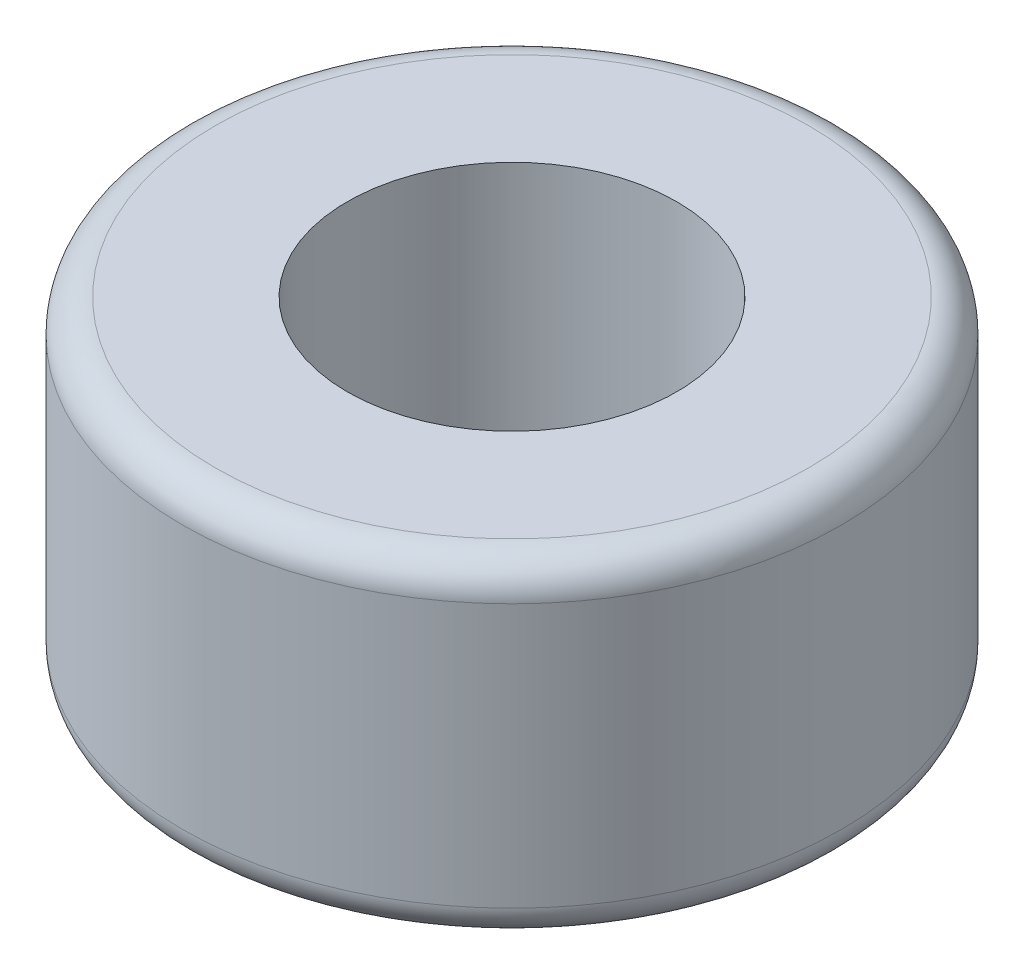
ISO-10303-21;
HEADER;
FILE_DESCRIPTION(('STEP AP214'),'2;1');
FILE_NAME('part.step','',(''),(''),'','','');
FILE_SCHEMA(('AUTOMOTIVE_DESIGN { 1 0 10303 214 1 1 1 1 }'));
ENDSEC;
DATA;
#1=APPLICATION_CONTEXT('core data for automotive mechanical design processes');
#2=APPLICATION_PROTOCOL_DEFINITION('international standard','automotive_design',2000,#1);
#3=PRODUCT_CONTEXT('',#1,'mechanical');
#4=PRODUCT('Part','Part','',(#3));
#5=PRODUCT_RELATED_PRODUCT_CATEGORY('part','',(#4));
#6=PRODUCT_DEFINITION_FORMATION('','',#4);
#7=PRODUCT_DEFINITION_CONTEXT('part definition',#1,'design');
#8=PRODUCT_DEFINITION('design','',#6,#7);
#9=PRODUCT_DEFINITION_SHAPE('','',#8);
#10=(LENGTH_UNIT() NAMED_UNIT(*) SI_UNIT(.MILLI.,.METRE.));
#11=(NAMED_UNIT(*) PLANE_ANGLE_UNIT() SI_UNIT($,.RADIAN.));
#12=(NAMED_UNIT(*) SI_UNIT($,.STERADIAN.) SOLID_ANGLE_UNIT());
#13=UNCERTAINTY_MEASURE_WITH_UNIT(LENGTH_MEASURE(1.E-05),#10,'distance_accuracy_value','');
#14=(GEOMETRIC_REPRESENTATION_CONTEXT(3) GLOBAL_UNCERTAINTY_ASSIGNED_CONTEXT((#13)) GLOBAL_UNIT_ASSIGNED_CONTEXT((#10,
#11,#12)) REPRESENTATION_CONTEXT('',''));
#15=CARTESIAN_POINT('',(0.,0.,0.));
#16=DIRECTION('',(0.,0.,1.));
#17=DIRECTION('',(1.,0.,0.));
#18=AXIS2_PLACEMENT_3D('',#15,#16,#17);
#19=CARTESIAN_POINT('',(0.,1.,0.));
#20=DIRECTION('',(0.,1.,0.));
#21=DIRECTION('',(0.,0.,1.));
#22=AXIS2_PLACEMENT_3D('',#19,#20,#21);
#23=PLANE('',#22);
#24=CARTESIAN_POINT('',(0.,1.,0.));
#25=DIRECTION('',(0.,1.,0.));
#26=DIRECTION('',(0.,0.,1.));
#27=AXIS2_PLACEMENT_3D('',#24,#25,#26);
#28=CIRCLE('',#27,0.9);
#29=CARTESIAN_POINT('',(0.,1.,0.9));
#30=VERTEX_POINT('',#29);
#31=EDGE_CURVE('E45',#30,#30,#28,.T.);
#32=ORIENTED_EDGE('',*,*,#31,.T.);
#33=EDGE_LOOP('',(#32));
#34=FACE_BOUND('',#33,.T.);
#35=CARTESIAN_POINT('',(0.,1.,0.));
#36=DIRECTION('',(0.,1.,0.));
#37=DIRECTION('',(0.,0.,1.));
#38=AXIS2_PLACEMENT_3D('',#35,#36,#37);
#39=CIRCLE('',#38,0.5);
#40=CARTESIAN_POINT('',(0.,1.,0.5));
#41=VERTEX_POINT('',#40);
#42=EDGE_CURVE('E50',#41,#41,#39,.T.);
#43=ORIENTED_EDGE('',*,*,#42,.F.);
#44=EDGE_LOOP('',(#43));
#45=FACE_BOUND('',#44,.T.);
#46=ADVANCED_FACE('F30',(#34,#45),#23,.T.);
#47=CARTESIAN_POINT('',(0.,0.,0.));
#48=DIRECTION('',(0.,1.,0.));
#49=DIRECTION('',(0.,0.,1.));
#50=AXIS2_PLACEMENT_3D('',#47,#48,#49);
#51=PLANE('',#50);
#52=CARTESIAN_POINT('',(0.,0.,0.));
#53=DIRECTION('',(0.,1.,0.));
#54=DIRECTION('',(0.,0.,1.));
#55=AXIS2_PLACEMENT_3D('',#52,#53,#54);
#56=CIRCLE('',#55,0.9);
#57=CARTESIAN_POINT('',(0.,0.,0.9));
#58=VERTEX_POINT('',#57);
#59=EDGE_CURVE('E10',#58,#58,#56,.F.);
#60=ORIENTED_EDGE('',*,*,#59,.T.);
#61=EDGE_LOOP('',(#60));
#62=FACE_BOUND('',#61,.T.);
#63=CARTESIAN_POINT('',(0.,0.,0.));
#64=DIRECTION('',(0.,1.,0.));
#65=DIRECTION('',(0.,0.,1.));
#66=AXIS2_PLACEMENT_3D('',#63,#64,#65);
#67=CIRCLE('',#66,0.5);
#68=CARTESIAN_POINT('',(0.,0.,0.5));
#69=VERTEX_POINT('',#68);
#70=EDGE_CURVE('E51',#69,#69,#67,.T.);
#71=ORIENTED_EDGE('',*,*,#70,.T.);
#72=EDGE_LOOP('',(#71));
#73=FACE_BOUND('',#72,.T.);
#74=ADVANCED_FACE('F61',(#62,#73),#51,.F.);
#75=CARTESIAN_POINT('',(0.,1.,0.));
#76=DIRECTION('',(0.,-1.,0.));
#77=DIRECTION('',(0.,0.,-1.));
#78=AXIS2_PLACEMENT_3D('',#75,#76,#77);
#79=CYLINDRICAL_SURFACE('',#78,1.);
#80=CARTESIAN_POINT('',(0.,0.1,0.));
#81=DIRECTION('',(0.,1.,0.));
#82=DIRECTION('',(0.,0.,1.));
#83=AXIS2_PLACEMENT_3D('',#80,#81,#82);
#84=CIRCLE('',#83,1.);
#85=CARTESIAN_POINT('',(0.,0.1,1.));
#86=VERTEX_POINT('',#85);
#87=EDGE_CURVE('E37',#86,#86,#84,.T.);
#88=ORIENTED_EDGE('',*,*,#87,.T.);
#89=EDGE_LOOP('',(#88));
#90=FACE_BOUND('',#89,.T.);
#91=CARTESIAN_POINT('',(0.,0.9,0.));
#92=DIRECTION('',(0.,1.,0.));
#93=DIRECTION('',(0.,0.,1.));
#94=AXIS2_PLACEMENT_3D('',#91,#92,#93);
#95=CIRCLE('',#94,1.);
#96=CARTESIAN_POINT('',(0.,0.9,1.));
#97=VERTEX_POINT('',#96);
#98=EDGE_CURVE('E41',#97,#97,#95,.F.);
#99=ORIENTED_EDGE('',*,*,#98,.T.);
#100=EDGE_LOOP('',(#99));
#101=FACE_BOUND('',#100,.T.);
#102=ADVANCED_FACE('F67',(#90,#101),#79,.T.);
#103=CARTESIAN_POINT('',(0.,1.,0.));
#104=DIRECTION('',(0.,-1.,0.));
#105=DIRECTION('',(0.,0.,-1.));
#106=AXIS2_PLACEMENT_3D('',#103,#104,#105);
#107=CYLINDRICAL_SURFACE('',#106,0.5);
#108=ORIENTED_EDGE('',*,*,#42,.T.);
#109=EDGE_LOOP('',(#108));
#110=FACE_BOUND('',#109,.T.);
#111=ORIENTED_EDGE('',*,*,#70,.F.);
#112=EDGE_LOOP('',(#111));
#113=FACE_BOUND('',#112,.T.);
#114=ADVANCED_FACE('F57',(#110,#113),#107,.F.);
#115=CARTESIAN_POINT('',(0.,0.9,0.));
#116=DIRECTION('',(0.,1.,0.));
#117=DIRECTION('',(0.,0.,1.));
#118=AXIS2_PLACEMENT_3D('',#115,#116,#117);
#119=TOROIDAL_SURFACE('',#118,0.9,0.1);
#120=ORIENTED_EDGE('',*,*,#98,.F.);
#121=EDGE_LOOP('',(#120));
#122=FACE_BOUND('',#121,.T.);
#123=ORIENTED_EDGE('',*,*,#31,.F.);
#124=EDGE_LOOP('',(#123));
#125=FACE_BOUND('',#124,.T.);
#126=ADVANCED_FACE('F72',(#122,#125),#119,.T.);
#127=CARTESIAN_POINT('',(0.,0.1,0.));
#128=DIRECTION('',(0.,1.,0.));
#129=DIRECTION('',(0.,0.,1.));
#130=AXIS2_PLACEMENT_3D('',#127,#128,#129);
#131=TOROIDAL_SURFACE('',#130,0.9,0.1);
#132=ORIENTED_EDGE('',*,*,#59,.F.);
#133=EDGE_LOOP('',(#132));
#134=FACE_BOUND('',#133,.T.);
#135=ORIENTED_EDGE('',*,*,#87,.F.);
#136=EDGE_LOOP('',(#135));
#137=FACE_BOUND('',#136,.T.);
#138=ADVANCED_FACE('F32',(#134,#137),#131,.T.);
#139=CLOSED_SHELL('',(#46,#74,#102,#114,#126,#138));
#140=MANIFOLD_SOLID_BREP('B2',#139);
#141=ADVANCED_BREP_SHAPE_REPRESENTATION('',(#18,#140),#14);
#142=SHAPE_DEFINITION_REPRESENTATION(#9,#141);
ENDSEC;
END-ISO-10303-21;
